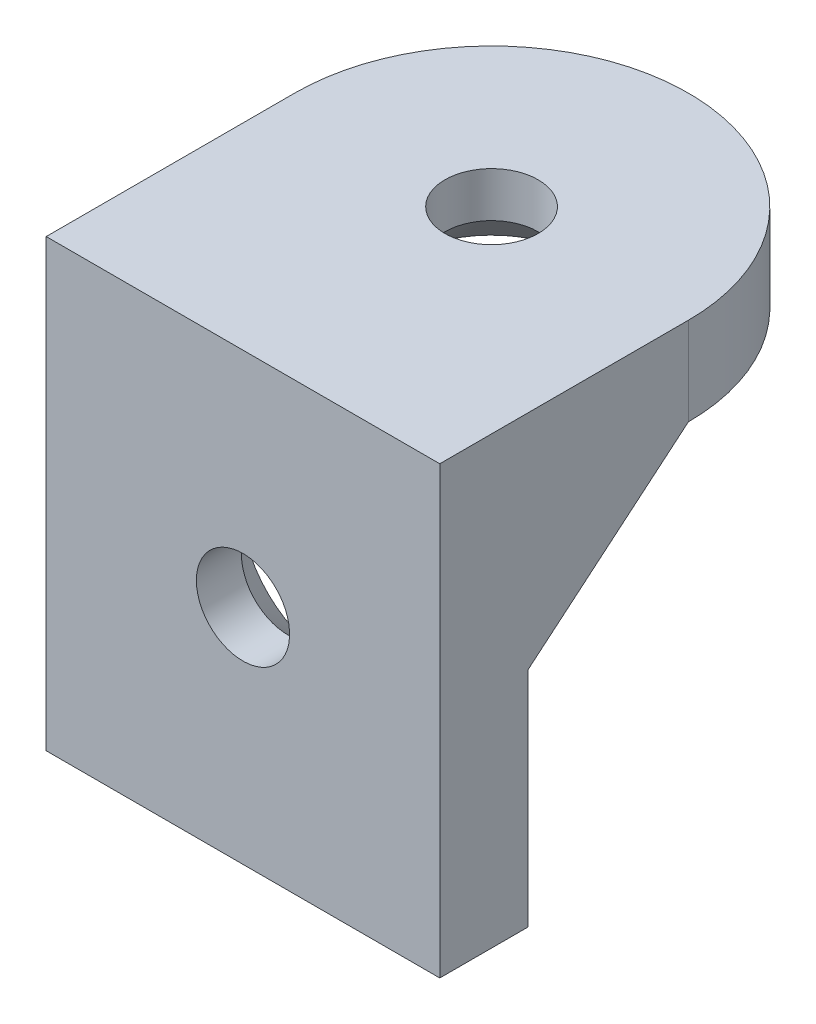
ISO-10303-21;
HEADER;
FILE_DESCRIPTION(('STEP AP214'),'2;1');
FILE_NAME('part.step','',(''),(''),'','','');
FILE_SCHEMA(('AUTOMOTIVE_DESIGN { 1 0 10303 214 1 1 1 1 }'));
ENDSEC;
DATA;
#1=APPLICATION_CONTEXT('core data for automotive mechanical design processes');
#2=APPLICATION_PROTOCOL_DEFINITION('international standard','automotive_design',2000,#1);
#3=PRODUCT_CONTEXT('',#1,'mechanical');
#4=PRODUCT('Part','Part','',(#3));
#5=PRODUCT_RELATED_PRODUCT_CATEGORY('part','',(#4));
#6=PRODUCT_DEFINITION_FORMATION('','',#4);
#7=PRODUCT_DEFINITION_CONTEXT('part definition',#1,'design');
#8=PRODUCT_DEFINITION('design','',#6,#7);
#9=PRODUCT_DEFINITION_SHAPE('','',#8);
#10=(LENGTH_UNIT() NAMED_UNIT(*) SI_UNIT(.MILLI.,.METRE.));
#11=(NAMED_UNIT(*) PLANE_ANGLE_UNIT() SI_UNIT($,.RADIAN.));
#12=(NAMED_UNIT(*) SI_UNIT($,.STERADIAN.) SOLID_ANGLE_UNIT());
#13=UNCERTAINTY_MEASURE_WITH_UNIT(LENGTH_MEASURE(1.E-05),#10,'distance_accuracy_value','');
#14=(GEOMETRIC_REPRESENTATION_CONTEXT(3) GLOBAL_UNCERTAINTY_ASSIGNED_CONTEXT((#13)) GLOBAL_UNIT_ASSIGNED_CONTEXT((#10,
#11,#12)) REPRESENTATION_CONTEXT('',''));
#15=CARTESIAN_POINT('',(0.,0.,0.));
#16=DIRECTION('',(0.,0.,1.));
#17=DIRECTION('',(1.,0.,0.));
#18=AXIS2_PLACEMENT_3D('',#15,#16,#17);
#19=CARTESIAN_POINT('',(19.,21.5,0.));
#20=DIRECTION('',(0.,0.,-1.));
#21=DIRECTION('',(-1.,0.,0.));
#22=AXIS2_PLACEMENT_3D('',#19,#20,#21);
#23=PLANE('',#22);
#24=CARTESIAN_POINT('',(0.,0.,0.));
#25=DIRECTION('',(0.,0.,-1.));
#26=DIRECTION('',(-1.,0.,0.));
#27=AXIS2_PLACEMENT_3D('',#24,#25,#26);
#28=CIRCLE('',#27,8.65);
#29=CARTESIAN_POINT('',(-8.65,0.,0.));
#30=VERTEX_POINT('',#29);
#31=EDGE_CURVE('E169',#30,#30,#28,.T.);
#32=ORIENTED_EDGE('',*,*,#31,.F.);
#33=EDGE_LOOP('',(#32));
#34=FACE_BOUND('',#33,.T.);
#35=DIRECTION('',(0.,-1.,0.));
#36=VECTOR('',#35,1.);
#37=CARTESIAN_POINT('',(-19.,-21.5,0.));
#38=LINE('',#37,#36);
#39=CARTESIAN_POINT('',(-19.,0.,0.));
#40=VERTEX_POINT('',#39);
#41=CARTESIAN_POINT('',(-19.,-21.5,0.));
#42=VERTEX_POINT('',#41);
#43=EDGE_CURVE('E60',#40,#42,#38,.T.);
#44=ORIENTED_EDGE('',*,*,#43,.F.);
#45=DIRECTION('',(-1.,0.,0.));
#46=VECTOR('',#45,1.);
#47=CARTESIAN_POINT('',(-15.2,0.,0.));
#48=LINE('',#47,#46);
#49=CARTESIAN_POINT('',(-15.2,0.,0.));
#50=VERTEX_POINT('',#49);
#51=EDGE_CURVE('E146',#50,#40,#48,.T.);
#52=ORIENTED_EDGE('',*,*,#51,.F.);
#53=DIRECTION('',(0.,-1.,0.));
#54=VECTOR('',#53,1.);
#55=CARTESIAN_POINT('',(-15.2,13.,0.));
#56=LINE('',#55,#54);
#57=CARTESIAN_POINT('',(-15.2,13.,0.));
#58=VERTEX_POINT('',#57);
#59=EDGE_CURVE('E159',#58,#50,#56,.T.);
#60=ORIENTED_EDGE('',*,*,#59,.F.);
#61=DIRECTION('',(-1.,0.,0.));
#62=VECTOR('',#61,1.);
#63=CARTESIAN_POINT('',(19.,13.,0.));
#64=LINE('',#63,#62);
#65=CARTESIAN_POINT('',(15.2,13.,0.));
#66=VERTEX_POINT('',#65);
#67=EDGE_CURVE('E11',#66,#58,#64,.T.);
#68=ORIENTED_EDGE('',*,*,#67,.F.);
#69=DIRECTION('',(0.,-1.,0.));
#70=VECTOR('',#69,1.);
#71=CARTESIAN_POINT('',(15.2,13.,0.));
#72=LINE('',#71,#70);
#73=CARTESIAN_POINT('',(15.2,0.,0.));
#74=VERTEX_POINT('',#73);
#75=EDGE_CURVE('E134',#66,#74,#72,.T.);
#76=ORIENTED_EDGE('',*,*,#75,.T.);
#77=DIRECTION('',(1.,0.,0.));
#78=VECTOR('',#77,1.);
#79=CARTESIAN_POINT('',(15.2,0.,0.));
#80=LINE('',#79,#78);
#81=CARTESIAN_POINT('',(19.,0.,0.));
#82=VERTEX_POINT('',#81);
#83=EDGE_CURVE('E126',#74,#82,#80,.T.);
#84=ORIENTED_EDGE('',*,*,#83,.T.);
#85=DIRECTION('',(0.,1.,0.));
#86=VECTOR('',#85,1.);
#87=CARTESIAN_POINT('',(19.,-21.5,0.));
#88=LINE('',#87,#86);
#89=CARTESIAN_POINT('',(19.,-21.5,0.));
#90=VERTEX_POINT('',#89);
#91=EDGE_CURVE('E110',#90,#82,#88,.T.);
#92=ORIENTED_EDGE('',*,*,#91,.F.);
#93=DIRECTION('',(1.,0.,0.));
#94=VECTOR('',#93,1.);
#95=CARTESIAN_POINT('',(-19.,-21.5,0.));
#96=LINE('',#95,#94);
#97=EDGE_CURVE('E114',#42,#90,#96,.T.);
#98=ORIENTED_EDGE('',*,*,#97,.F.);
#99=EDGE_LOOP('',(#44,#52,#60,#68,#76,#84,#92,#98));
#100=FACE_BOUND('',#99,.T.);
#101=ADVANCED_FACE('F31',(#34,#100),#23,.T.);
#102=CARTESIAN_POINT('',(0.,13.,-15.5));
#103=DIRECTION('',(0.,-1.,0.));
#104=DIRECTION('',(0.,0.,-1.));
#105=AXIS2_PLACEMENT_3D('',#102,#103,#104);
#106=PLANE('',#105);
#107=CARTESIAN_POINT('',(0.,13.,-15.5));
#108=DIRECTION('',(0.,-1.,0.));
#109=DIRECTION('',(0.,0.,-1.));
#110=AXIS2_PLACEMENT_3D('',#107,#108,#109);
#111=CIRCLE('',#110,8.65);
#112=CARTESIAN_POINT('',(0.,13.,-24.15));
#113=VERTEX_POINT('',#112);
#114=EDGE_CURVE('E178',#113,#113,#111,.T.);
#115=ORIENTED_EDGE('',*,*,#114,.F.);
#116=EDGE_LOOP('',(#115));
#117=FACE_BOUND('',#116,.T.);
#118=DIRECTION('',(0.,0.,1.));
#119=VECTOR('',#118,1.);
#120=CARTESIAN_POINT('',(-15.2,13.,-15.5));
#121=LINE('',#120,#119);
#122=CARTESIAN_POINT('',(-15.2,13.,-15.5));
#123=VERTEX_POINT('',#122);
#124=EDGE_CURVE('E149',#123,#58,#121,.T.);
#125=ORIENTED_EDGE('',*,*,#124,.F.);
#126=DIRECTION('',(-1.,0.,0.));
#127=VECTOR('',#126,1.);
#128=CARTESIAN_POINT('',(-15.2,13.,-15.5));
#129=LINE('',#128,#127);
#130=CARTESIAN_POINT('',(-19.,13.,-15.5));
#131=VERTEX_POINT('',#130);
#132=EDGE_CURVE('E138',#123,#131,#129,.T.);
#133=ORIENTED_EDGE('',*,*,#132,.T.);
#134=CARTESIAN_POINT('',(0.,13.,-15.5));
#135=DIRECTION('',(0.,1.,0.));
#136=DIRECTION('',(0.,0.,-1.));
#137=AXIS2_PLACEMENT_3D('',#134,#135,#136);
#138=CIRCLE('',#137,19.);
#139=CARTESIAN_POINT('',(19.,13.,-15.5));
#140=VERTEX_POINT('',#139);
#141=EDGE_CURVE('E123',#140,#131,#138,.T.);
#142=ORIENTED_EDGE('',*,*,#141,.F.);
#143=DIRECTION('',(1.,0.,0.));
#144=VECTOR('',#143,1.);
#145=CARTESIAN_POINT('',(15.2,13.,-15.5));
#146=LINE('',#145,#144);
#147=CARTESIAN_POINT('',(15.2,13.,-15.5));
#148=VERTEX_POINT('',#147);
#149=EDGE_CURVE('E130',#148,#140,#146,.T.);
#150=ORIENTED_EDGE('',*,*,#149,.F.);
#151=DIRECTION('',(0.,0.,1.));
#152=VECTOR('',#151,1.);
#153=CARTESIAN_POINT('',(15.2,13.,-15.5));
#154=LINE('',#153,#152);
#155=EDGE_CURVE('E141',#148,#66,#154,.T.);
#156=ORIENTED_EDGE('',*,*,#155,.T.);
#157=ORIENTED_EDGE('',*,*,#67,.T.);
#158=EDGE_LOOP('',(#125,#133,#142,#150,#156,#157));
#159=FACE_BOUND('',#158,.T.);
#160=ADVANCED_FACE('F184',(#117,#159),#106,.T.);
#161=CARTESIAN_POINT('',(19.,-21.5,8.5));
#162=DIRECTION('',(-1.,0.,0.));
#163=DIRECTION('',(0.,0.,1.));
#164=AXIS2_PLACEMENT_3D('',#161,#162,#163);
#165=PLANE('',#164);
#166=ORIENTED_EDGE('',*,*,#91,.T.);
#167=DIRECTION('',(0.,0.642612261976471,-0.766191543125792));
#168=VECTOR('',#167,1.);
#169=CARTESIAN_POINT('',(19.,0.,0.));
#170=LINE('',#169,#168);
#171=EDGE_CURVE('E71',#82,#140,#170,.T.);
#172=ORIENTED_EDGE('',*,*,#171,.T.);
#173=DIRECTION('',(0.,1.,0.));
#174=VECTOR('',#173,1.);
#175=CARTESIAN_POINT('',(19.,13.,-15.5));
#176=LINE('',#175,#174);
#177=CARTESIAN_POINT('',(19.,21.5,-15.5));
#178=VERTEX_POINT('',#177);
#179=EDGE_CURVE('E119',#140,#178,#176,.T.);
#180=ORIENTED_EDGE('',*,*,#179,.T.);
#181=DIRECTION('',(0.,0.,-1.));
#182=VECTOR('',#181,1.);
#183=CARTESIAN_POINT('',(19.,21.5,8.5));
#184=LINE('',#183,#182);
#185=CARTESIAN_POINT('',(19.,21.5,8.5));
#186=VERTEX_POINT('',#185);
#187=EDGE_CURVE('E40',#186,#178,#184,.T.);
#188=ORIENTED_EDGE('',*,*,#187,.F.);
#189=DIRECTION('',(0.,1.,0.));
#190=VECTOR('',#189,1.);
#191=CARTESIAN_POINT('',(19.,-21.5,8.5));
#192=LINE('',#191,#190);
#193=CARTESIAN_POINT('',(19.,-21.5,8.5));
#194=VERTEX_POINT('',#193);
#195=EDGE_CURVE('E91',#194,#186,#192,.T.);
#196=ORIENTED_EDGE('',*,*,#195,.F.);
#197=DIRECTION('',(0.,0.,-1.));
#198=VECTOR('',#197,1.);
#199=CARTESIAN_POINT('',(19.,-21.5,8.5));
#200=LINE('',#199,#198);
#201=EDGE_CURVE('E106',#194,#90,#200,.T.);
#202=ORIENTED_EDGE('',*,*,#201,.T.);
#203=EDGE_LOOP('',(#166,#172,#180,#188,#196,#202));
#204=FACE_BOUND('',#203,.T.);
#205=ADVANCED_FACE('F33',(#204),#165,.F.);
#206=CARTESIAN_POINT('',(-19.,21.5,8.5));
#207=DIRECTION('',(0.,-1.,0.));
#208=DIRECTION('',(0.,0.,-1.));
#209=AXIS2_PLACEMENT_3D('',#206,#207,#208);
#210=PLANE('',#209);
#211=CARTESIAN_POINT('',(0.,21.5,-15.5));
#212=DIRECTION('',(0.,-1.,0.));
#213=DIRECTION('',(0.,0.,-1.));
#214=AXIS2_PLACEMENT_3D('',#211,#212,#213);
#215=CIRCLE('',#214,4.5);
#216=CARTESIAN_POINT('',(0.,21.5,-20.));
#217=VERTEX_POINT('',#216);
#218=EDGE_CURVE('E172',#217,#217,#215,.T.);
#219=ORIENTED_EDGE('',*,*,#218,.T.);
#220=EDGE_LOOP('',(#219));
#221=FACE_BOUND('',#220,.T.);
#222=ORIENTED_EDGE('',*,*,#187,.T.);
#223=CARTESIAN_POINT('',(0.,21.5,-15.5));
#224=DIRECTION('',(0.,1.,0.));
#225=DIRECTION('',(0.,0.,-1.));
#226=AXIS2_PLACEMENT_3D('',#223,#224,#225);
#227=CIRCLE('',#226,19.);
#228=CARTESIAN_POINT('',(-19.,21.5,-15.5));
#229=VERTEX_POINT('',#228);
#230=EDGE_CURVE('E99',#178,#229,#227,.T.);
#231=ORIENTED_EDGE('',*,*,#230,.T.);
#232=DIRECTION('',(0.,0.,-1.));
#233=VECTOR('',#232,1.);
#234=CARTESIAN_POINT('',(-19.,21.5,8.5));
#235=LINE('',#234,#233);
#236=CARTESIAN_POINT('',(-19.,21.5,8.5));
#237=VERTEX_POINT('',#236);
#238=EDGE_CURVE('E96',#237,#229,#235,.T.);
#239=ORIENTED_EDGE('',*,*,#238,.F.);
#240=DIRECTION('',(-1.,0.,0.));
#241=VECTOR('',#240,1.);
#242=CARTESIAN_POINT('',(-19.,21.5,8.5));
#243=LINE('',#242,#241);
#244=EDGE_CURVE('E85',#186,#237,#243,.T.);
#245=ORIENTED_EDGE('',*,*,#244,.F.);
#246=EDGE_LOOP('',(#222,#231,#239,#245));
#247=FACE_BOUND('',#246,.T.);
#248=ADVANCED_FACE('F97',(#221,#247),#210,.F.);
#249=CARTESIAN_POINT('',(-19.,-21.5,8.5));
#250=DIRECTION('',(1.,0.,0.));
#251=DIRECTION('',(0.,0.,-1.));
#252=AXIS2_PLACEMENT_3D('',#249,#250,#251);
#253=PLANE('',#252);
#254=DIRECTION('',(0.,0.642612261976471,-0.766191543125792));
#255=VECTOR('',#254,1.);
#256=CARTESIAN_POINT('',(-19.,0.,0.));
#257=LINE('',#256,#255);
#258=EDGE_CURVE('E152',#40,#131,#257,.T.);
#259=ORIENTED_EDGE('',*,*,#258,.F.);
#260=ORIENTED_EDGE('',*,*,#43,.T.);
#261=DIRECTION('',(0.,0.,-1.));
#262=VECTOR('',#261,1.);
#263=CARTESIAN_POINT('',(-19.,-21.5,8.5));
#264=LINE('',#263,#262);
#265=CARTESIAN_POINT('',(-19.,-21.5,8.5));
#266=VERTEX_POINT('',#265);
#267=EDGE_CURVE('E102',#266,#42,#264,.T.);
#268=ORIENTED_EDGE('',*,*,#267,.F.);
#269=DIRECTION('',(0.,-1.,0.));
#270=VECTOR('',#269,1.);
#271=CARTESIAN_POINT('',(-19.,-21.5,8.5));
#272=LINE('',#271,#270);
#273=EDGE_CURVE('E89',#237,#266,#272,.T.);
#274=ORIENTED_EDGE('',*,*,#273,.F.);
#275=ORIENTED_EDGE('',*,*,#238,.T.);
#276=DIRECTION('',(0.,1.,0.));
#277=VECTOR('',#276,1.);
#278=CARTESIAN_POINT('',(-19.,13.,-15.5));
#279=LINE('',#278,#277);
#280=EDGE_CURVE('E112',#131,#229,#279,.T.);
#281=ORIENTED_EDGE('',*,*,#280,.F.);
#282=EDGE_LOOP('',(#259,#260,#268,#274,#275,#281));
#283=FACE_BOUND('',#282,.T.);
#284=ADVANCED_FACE('F104',(#283),#253,.F.);
#285=CARTESIAN_POINT('',(-19.,-21.5,8.5));
#286=DIRECTION('',(0.,1.,0.));
#287=DIRECTION('',(0.,0.,1.));
#288=AXIS2_PLACEMENT_3D('',#285,#286,#287);
#289=PLANE('',#288);
#290=ORIENTED_EDGE('',*,*,#97,.T.);
#291=ORIENTED_EDGE('',*,*,#201,.F.);
#292=DIRECTION('',(1.,0.,0.));
#293=VECTOR('',#292,1.);
#294=CARTESIAN_POINT('',(-19.,-21.5,8.5));
#295=LINE('',#294,#293);
#296=EDGE_CURVE('E48',#266,#194,#295,.T.);
#297=ORIENTED_EDGE('',*,*,#296,.F.);
#298=ORIENTED_EDGE('',*,*,#267,.T.);
#299=EDGE_LOOP('',(#290,#291,#297,#298));
#300=FACE_BOUND('',#299,.T.);
#301=ADVANCED_FACE('F224',(#300),#289,.F.);
#302=CARTESIAN_POINT('',(19.,21.5,8.5));
#303=DIRECTION('',(0.,0.,-1.));
#304=DIRECTION('',(-1.,0.,0.));
#305=AXIS2_PLACEMENT_3D('',#302,#303,#304);
#306=PLANE('',#305);
#307=CARTESIAN_POINT('',(0.,0.,8.5));
#308=DIRECTION('',(0.,0.,-1.));
#309=DIRECTION('',(-1.,0.,0.));
#310=AXIS2_PLACEMENT_3D('',#307,#308,#309);
#311=CIRCLE('',#310,4.5);
#312=CARTESIAN_POINT('',(-4.5,0.,8.5));
#313=VERTEX_POINT('',#312);
#314=EDGE_CURVE('E156',#313,#313,#311,.T.);
#315=ORIENTED_EDGE('',*,*,#314,.T.);
#316=EDGE_LOOP('',(#315));
#317=FACE_BOUND('',#316,.T.);
#318=ORIENTED_EDGE('',*,*,#195,.T.);
#319=ORIENTED_EDGE('',*,*,#244,.T.);
#320=ORIENTED_EDGE('',*,*,#273,.T.);
#321=ORIENTED_EDGE('',*,*,#296,.T.);
#322=EDGE_LOOP('',(#318,#319,#320,#321));
#323=FACE_BOUND('',#322,.T.);
#324=ADVANCED_FACE('F87',(#317,#323),#306,.F.);
#325=CARTESIAN_POINT('',(0.,13.,-15.5));
#326=DIRECTION('',(0.,1.,0.));
#327=DIRECTION('',(0.,0.,1.));
#328=AXIS2_PLACEMENT_3D('',#325,#326,#327);
#329=CYLINDRICAL_SURFACE('',#328,19.);
#330=ORIENTED_EDGE('',*,*,#230,.F.);
#331=ORIENTED_EDGE('',*,*,#179,.F.);
#332=ORIENTED_EDGE('',*,*,#141,.T.);
#333=ORIENTED_EDGE('',*,*,#280,.T.);
#334=EDGE_LOOP('',(#330,#331,#332,#333));
#335=FACE_BOUND('',#334,.T.);
#336=ADVANCED_FACE('F125',(#335),#329,.T.);
#337=CARTESIAN_POINT('',(15.2,0.,0.));
#338=DIRECTION('',(0.,-0.766191543125792,-0.642612261976471));
#339=DIRECTION('',(0.,0.642612261976471,-0.766191543125793));
#340=AXIS2_PLACEMENT_3D('',#337,#338,#339);
#341=PLANE('',#340);
#342=ORIENTED_EDGE('',*,*,#171,.F.);
#343=ORIENTED_EDGE('',*,*,#83,.F.);
#344=DIRECTION('',(0.,0.642612261976471,-0.766191543125792));
#345=VECTOR('',#344,1.);
#346=CARTESIAN_POINT('',(15.2,0.,0.));
#347=LINE('',#346,#345);
#348=EDGE_CURVE('E137',#74,#148,#347,.T.);
#349=ORIENTED_EDGE('',*,*,#348,.T.);
#350=ORIENTED_EDGE('',*,*,#149,.T.);
#351=EDGE_LOOP('',(#342,#343,#349,#350));
#352=FACE_BOUND('',#351,.T.);
#353=ADVANCED_FACE('F216',(#352),#341,.T.);
#354=CARTESIAN_POINT('',(15.2,0.,0.));
#355=DIRECTION('',(-1.,0.,0.));
#356=DIRECTION('',(0.,0.,1.));
#357=AXIS2_PLACEMENT_3D('',#354,#355,#356);
#358=PLANE('',#357);
#359=ORIENTED_EDGE('',*,*,#348,.F.);
#360=ORIENTED_EDGE('',*,*,#75,.F.);
#361=ORIENTED_EDGE('',*,*,#155,.F.);
#362=EDGE_LOOP('',(#359,#360,#361));
#363=FACE_BOUND('',#362,.T.);
#364=ADVANCED_FACE('F221',(#363),#358,.T.);
#365=CARTESIAN_POINT('',(-15.2,0.,0.));
#366=DIRECTION('',(0.,0.766191543125792,0.642612261976471));
#367=DIRECTION('',(0.,-0.642612261976471,0.766191543125793));
#368=AXIS2_PLACEMENT_3D('',#365,#366,#367);
#369=PLANE('',#368);
#370=ORIENTED_EDGE('',*,*,#258,.T.);
#371=ORIENTED_EDGE('',*,*,#132,.F.);
#372=DIRECTION('',(0.,0.642612261976471,-0.766191543125792));
#373=VECTOR('',#372,1.);
#374=CARTESIAN_POINT('',(-15.2,0.,0.));
#375=LINE('',#374,#373);
#376=EDGE_CURVE('E155',#50,#123,#375,.T.);
#377=ORIENTED_EDGE('',*,*,#376,.F.);
#378=ORIENTED_EDGE('',*,*,#51,.T.);
#379=EDGE_LOOP('',(#370,#371,#377,#378));
#380=FACE_BOUND('',#379,.T.);
#381=ADVANCED_FACE('F208',(#380),#369,.F.);
#382=CARTESIAN_POINT('',(-15.2,0.,0.));
#383=DIRECTION('',(1.,0.,0.));
#384=DIRECTION('',(0.,0.,1.));
#385=AXIS2_PLACEMENT_3D('',#382,#383,#384);
#386=PLANE('',#385);
#387=ORIENTED_EDGE('',*,*,#376,.T.);
#388=ORIENTED_EDGE('',*,*,#124,.T.);
#389=ORIENTED_EDGE('',*,*,#59,.T.);
#390=EDGE_LOOP('',(#387,#388,#389));
#391=FACE_BOUND('',#390,.T.);
#392=ADVANCED_FACE('F197',(#391),#386,.T.);
#393=CARTESIAN_POINT('',(0.,0.,0.));
#394=DIRECTION('',(0.,0.,-1.));
#395=DIRECTION('',(-1.,0.,0.));
#396=AXIS2_PLACEMENT_3D('',#393,#394,#395);
#397=CYLINDRICAL_SURFACE('',#396,4.5);
#398=ORIENTED_EDGE('',*,*,#314,.F.);
#399=EDGE_LOOP('',(#398));
#400=FACE_BOUND('',#399,.T.);
#401=CARTESIAN_POINT('',(0.,0.,4.15));
#402=DIRECTION('',(0.,0.,-1.));
#403=DIRECTION('',(-1.,0.,0.));
#404=AXIS2_PLACEMENT_3D('',#401,#402,#403);
#405=CIRCLE('',#404,4.5);
#406=CARTESIAN_POINT('',(-4.5,0.,4.15));
#407=VERTEX_POINT('',#406);
#408=EDGE_CURVE('E166',#407,#407,#405,.T.);
#409=ORIENTED_EDGE('',*,*,#408,.T.);
#410=EDGE_LOOP('',(#409));
#411=FACE_BOUND('',#410,.T.);
#412=ADVANCED_FACE('F251',(#400,#411),#397,.F.);
#413=CARTESIAN_POINT('',(0.,0.,0.));
#414=DIRECTION('',(0.,0.,-1.));
#415=DIRECTION('',(-1.,0.,0.));
#416=AXIS2_PLACEMENT_3D('',#413,#414,#415);
#417=CONICAL_SURFACE('',#416,8.65,0.785398163397448);
#418=ORIENTED_EDGE('',*,*,#408,.F.);
#419=EDGE_LOOP('',(#418));
#420=FACE_BOUND('',#419,.T.);
#421=ORIENTED_EDGE('',*,*,#31,.T.);
#422=EDGE_LOOP('',(#421));
#423=FACE_BOUND('',#422,.T.);
#424=ADVANCED_FACE('F254',(#420,#423),#417,.F.);
#425=CARTESIAN_POINT('',(0.,13.,-15.5));
#426=DIRECTION('',(0.,-1.,0.));
#427=DIRECTION('',(0.,0.,-1.));
#428=AXIS2_PLACEMENT_3D('',#425,#426,#427);
#429=CYLINDRICAL_SURFACE('',#428,4.49999999999999);
#430=ORIENTED_EDGE('',*,*,#218,.F.);
#431=EDGE_LOOP('',(#430));
#432=FACE_BOUND('',#431,.T.);
#433=CARTESIAN_POINT('',(0.,17.15,-15.5));
#434=DIRECTION('',(0.,-1.,0.));
#435=DIRECTION('',(0.,0.,-1.));
#436=AXIS2_PLACEMENT_3D('',#433,#434,#435);
#437=CIRCLE('',#436,4.49999999999999);
#438=CARTESIAN_POINT('',(0.,17.15,-20.));
#439=VERTEX_POINT('',#438);
#440=EDGE_CURVE('E175',#439,#439,#437,.T.);
#441=ORIENTED_EDGE('',*,*,#440,.T.);
#442=EDGE_LOOP('',(#441));
#443=FACE_BOUND('',#442,.T.);
#444=ADVANCED_FACE('F258',(#432,#443),#429,.F.);
#445=CARTESIAN_POINT('',(0.,13.,-15.5));
#446=DIRECTION('',(0.,-1.,0.));
#447=DIRECTION('',(0.,0.,-1.));
#448=AXIS2_PLACEMENT_3D('',#445,#446,#447);
#449=CONICAL_SURFACE('',#448,8.65,0.785398163397451);
#450=ORIENTED_EDGE('',*,*,#440,.F.);
#451=EDGE_LOOP('',(#450));
#452=FACE_BOUND('',#451,.T.);
#453=ORIENTED_EDGE('',*,*,#114,.T.);
#454=EDGE_LOOP('',(#453));
#455=FACE_BOUND('',#454,.T.);
#456=ADVANCED_FACE('F182',(#452,#455),#449,.F.);
#457=CLOSED_SHELL('',(#101,#160,#205,#248,#284,#301,#324,#336,#353,#364,#381,#392,#412,#424,
#444,#456));
#458=MANIFOLD_SOLID_BREP('B2',#457);
#459=ADVANCED_BREP_SHAPE_REPRESENTATION('',(#18,#458),#14);
#460=SHAPE_DEFINITION_REPRESENTATION(#9,#459);
ENDSEC;
END-ISO-10303-21;
